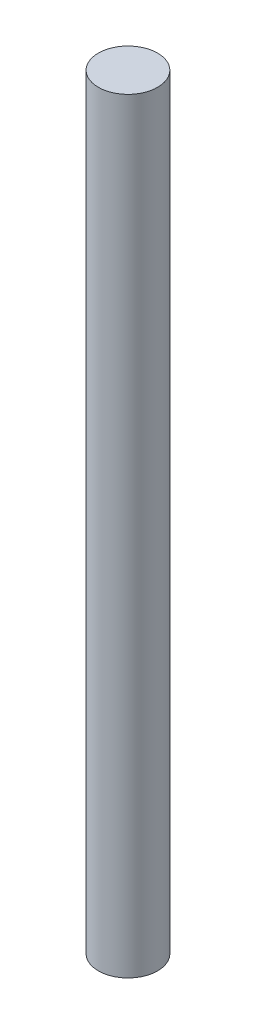
ISO-10303-21;
HEADER;
FILE_DESCRIPTION(('STEP AP214'),'2;1');
FILE_NAME('part.step','',(''),(''),'','','');
FILE_SCHEMA(('AUTOMOTIVE_DESIGN { 1 0 10303 214 1 1 1 1 }'));
ENDSEC;
DATA;
#1=APPLICATION_CONTEXT('core data for automotive mechanical design processes');
#2=APPLICATION_PROTOCOL_DEFINITION('international standard','automotive_design',2000,#1);
#3=PRODUCT_CONTEXT('',#1,'mechanical');
#4=PRODUCT('Part','Part','',(#3));
#5=PRODUCT_RELATED_PRODUCT_CATEGORY('part','',(#4));
#6=PRODUCT_DEFINITION_FORMATION('','',#4);
#7=PRODUCT_DEFINITION_CONTEXT('part definition',#1,'design');
#8=PRODUCT_DEFINITION('design','',#6,#7);
#9=PRODUCT_DEFINITION_SHAPE('','',#8);
#10=(LENGTH_UNIT() NAMED_UNIT(*) SI_UNIT(.MILLI.,.METRE.));
#11=(NAMED_UNIT(*) PLANE_ANGLE_UNIT() SI_UNIT($,.RADIAN.));
#12=(NAMED_UNIT(*) SI_UNIT($,.STERADIAN.) SOLID_ANGLE_UNIT());
#13=UNCERTAINTY_MEASURE_WITH_UNIT(LENGTH_MEASURE(1.E-05),#10,'distance_accuracy_value','');
#14=(GEOMETRIC_REPRESENTATION_CONTEXT(3) GLOBAL_UNCERTAINTY_ASSIGNED_CONTEXT((#13)) GLOBAL_UNIT_ASSIGNED_CONTEXT((#10,
#11,#12)) REPRESENTATION_CONTEXT('',''));
#15=CARTESIAN_POINT('',(0.,0.,0.));
#16=DIRECTION('',(0.,0.,1.));
#17=DIRECTION('',(1.,0.,0.));
#18=AXIS2_PLACEMENT_3D('',#15,#16,#17);
#19=CARTESIAN_POINT('',(0.,155.,0.));
#20=DIRECTION('',(0.,-1.,0.));
#21=DIRECTION('',(0.,0.,-1.));
#22=AXIS2_PLACEMENT_3D('',#19,#20,#21);
#23=CYLINDRICAL_SURFACE('',#22,6.);
#24=CARTESIAN_POINT('',(0.,155.,0.));
#25=DIRECTION('',(0.,1.,0.));
#26=DIRECTION('',(0.,0.,1.));
#27=AXIS2_PLACEMENT_3D('',#24,#25,#26);
#28=CIRCLE('',#27,6.);
#29=CARTESIAN_POINT('',(0.,155.,6.));
#30=VERTEX_POINT('',#29);
#31=EDGE_CURVE('E10',#30,#30,#28,.T.);
#32=ORIENTED_EDGE('',*,*,#31,.F.);
#33=EDGE_LOOP('',(#32));
#34=FACE_BOUND('',#33,.T.);
#35=CARTESIAN_POINT('',(0.,0.,0.));
#36=DIRECTION('',(0.,1.,0.));
#37=DIRECTION('',(0.,0.,1.));
#38=AXIS2_PLACEMENT_3D('',#35,#36,#37);
#39=CIRCLE('',#38,6.);
#40=CARTESIAN_POINT('',(0.,0.,6.));
#41=VERTEX_POINT('',#40);
#42=EDGE_CURVE('E48',#41,#41,#39,.T.);
#43=ORIENTED_EDGE('',*,*,#42,.T.);
#44=EDGE_LOOP('',(#43));
#45=FACE_BOUND('',#44,.T.);
#46=ADVANCED_FACE('F45',(#34,#45),#23,.T.);
#47=CARTESIAN_POINT('',(0.,155.,0.));
#48=DIRECTION('',(0.,1.,0.));
#49=DIRECTION('',(0.,0.,1.));
#50=AXIS2_PLACEMENT_3D('',#47,#48,#49);
#51=PLANE('',#50);
#52=ORIENTED_EDGE('',*,*,#31,.T.);
#53=EDGE_LOOP('',(#52));
#54=FACE_BOUND('',#53,.T.);
#55=ADVANCED_FACE('F60',(#54),#51,.T.);
#56=CARTESIAN_POINT('',(0.,0.,0.));
#57=DIRECTION('',(0.,1.,0.));
#58=DIRECTION('',(0.,0.,1.));
#59=AXIS2_PLACEMENT_3D('',#56,#57,#58);
#60=PLANE('',#59);
#61=ORIENTED_EDGE('',*,*,#42,.F.);
#62=EDGE_LOOP('',(#61));
#63=FACE_BOUND('',#62,.T.);
#64=ADVANCED_FACE('F58',(#63),#60,.F.);
#65=CLOSED_SHELL('',(#46,#55,#64));
#66=MANIFOLD_SOLID_BREP('B2',#65);
#67=ADVANCED_BREP_SHAPE_REPRESENTATION('',(#18,#66),#14);
#68=SHAPE_DEFINITION_REPRESENTATION(#9,#67);
ENDSEC;
END-ISO-10303-21;
